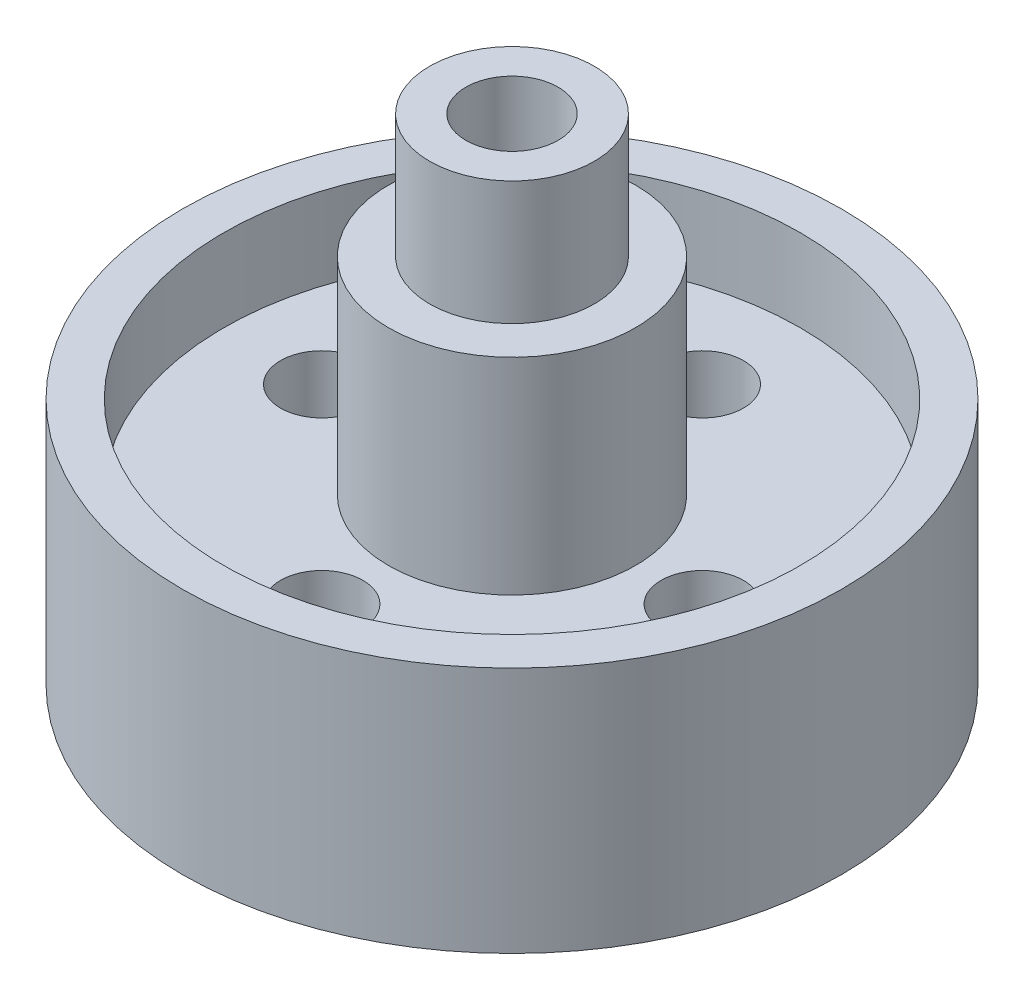
ISO-10303-21;
HEADER;
FILE_DESCRIPTION(('STEP AP214'),'2;1');
FILE_NAME('part.step','',(''),(''),'','','');
FILE_SCHEMA(('AUTOMOTIVE_DESIGN { 1 0 10303 214 1 1 1 1 }'));
ENDSEC;
DATA;
#1=APPLICATION_CONTEXT('core data for automotive mechanical design processes');
#2=APPLICATION_PROTOCOL_DEFINITION('international standard','automotive_design',2000,#1);
#3=PRODUCT_CONTEXT('',#1,'mechanical');
#4=PRODUCT('Part','Part','',(#3));
#5=PRODUCT_RELATED_PRODUCT_CATEGORY('part','',(#4));
#6=PRODUCT_DEFINITION_FORMATION('','',#4);
#7=PRODUCT_DEFINITION_CONTEXT('part definition',#1,'design');
#8=PRODUCT_DEFINITION('design','',#6,#7);
#9=PRODUCT_DEFINITION_SHAPE('','',#8);
#10=(LENGTH_UNIT() NAMED_UNIT(*) SI_UNIT(.MILLI.,.METRE.));
#11=(NAMED_UNIT(*) PLANE_ANGLE_UNIT() SI_UNIT($,.RADIAN.));
#12=(NAMED_UNIT(*) SI_UNIT($,.STERADIAN.) SOLID_ANGLE_UNIT());
#13=UNCERTAINTY_MEASURE_WITH_UNIT(LENGTH_MEASURE(1.E-05),#10,'distance_accuracy_value','');
#14=(GEOMETRIC_REPRESENTATION_CONTEXT(3) GLOBAL_UNCERTAINTY_ASSIGNED_CONTEXT((#13)) GLOBAL_UNIT_ASSIGNED_CONTEXT((#10,
#11,#12)) REPRESENTATION_CONTEXT('',''));
#15=CARTESIAN_POINT('',(0.,0.,0.));
#16=DIRECTION('',(0.,0.,1.));
#17=DIRECTION('',(1.,0.,0.));
#18=AXIS2_PLACEMENT_3D('',#15,#16,#17);
#19=CARTESIAN_POINT('',(0.,38.1,0.));
#20=DIRECTION('',(0.,-1.,0.));
#21=DIRECTION('',(0.,0.,-1.));
#22=AXIS2_PLACEMENT_3D('',#19,#20,#21);
#23=CYLINDRICAL_SURFACE('',#22,44.45);
#24=CARTESIAN_POINT('',(0.,25.4,0.));
#25=DIRECTION('',(0.,1.,0.));
#26=DIRECTION('',(0.,0.,1.));
#27=AXIS2_PLACEMENT_3D('',#24,#25,#26);
#28=CIRCLE('',#27,44.45);
#29=CARTESIAN_POINT('',(0.,25.4,-44.45));
#30=VERTEX_POINT('',#29);
#31=EDGE_CURVE('E10',#30,#30,#28,.T.);
#32=CARTESIAN_POINT('',(0.,38.1,0.));
#33=DIRECTION('',(0.,1.,0.));
#34=DIRECTION('',(0.,0.,1.));
#35=AXIS2_PLACEMENT_3D('',#32,#33,#34);
#36=CIRCLE('',#35,44.45);
#37=CARTESIAN_POINT('',(0.,38.1,-44.45));
#38=VERTEX_POINT('',#37);
#39=EDGE_CURVE('E49',#38,#38,#36,.T.);
#40=CARTESIAN_POINT('',(0.,25.4,-44.45));
#41=CARTESIAN_POINT('',(0.,25.5322916666667,-44.45));
#42=CARTESIAN_POINT('',(0.,25.6645833333333,-44.45));
#43=CARTESIAN_POINT('',(0.,25.9291666666667,-44.45));
#44=CARTESIAN_POINT('',(0.,26.0614583333333,-44.45));
#45=CARTESIAN_POINT('',(0.,26.3260416666667,-44.45));
#46=CARTESIAN_POINT('',(0.,26.4583333333333,-44.45));
#47=CARTESIAN_POINT('',(0.,26.7229166666667,-44.45));
#48=CARTESIAN_POINT('',(0.,26.8552083333333,-44.45));
#49=CARTESIAN_POINT('',(0.,27.1197916666667,-44.45));
#50=CARTESIAN_POINT('',(0.,27.2520833333333,-44.45));
#51=CARTESIAN_POINT('',(0.,27.5166666666667,-44.45));
#52=CARTESIAN_POINT('',(0.,27.6489583333333,-44.45));
#53=CARTESIAN_POINT('',(0.,27.9135416666667,-44.45));
#54=CARTESIAN_POINT('',(0.,28.0458333333333,-44.45));
#55=CARTESIAN_POINT('',(0.,28.3104166666667,-44.45));
#56=CARTESIAN_POINT('',(0.,28.4427083333333,-44.45));
#57=CARTESIAN_POINT('',(0.,28.7072916666667,-44.45));
#58=CARTESIAN_POINT('',(0.,28.8395833333333,-44.45));
#59=CARTESIAN_POINT('',(0.,29.1041666666667,-44.45));
#60=CARTESIAN_POINT('',(0.,29.2364583333333,-44.45));
#61=CARTESIAN_POINT('',(0.,29.5010416666667,-44.45));
#62=CARTESIAN_POINT('',(0.,29.6333333333333,-44.45));
#63=CARTESIAN_POINT('',(0.,29.8979166666667,-44.45));
#64=CARTESIAN_POINT('',(0.,30.0302083333333,-44.45));
#65=CARTESIAN_POINT('',(0.,30.2947916666667,-44.45));
#66=CARTESIAN_POINT('',(0.,30.4270833333333,-44.45));
#67=CARTESIAN_POINT('',(0.,30.6916666666667,-44.45));
#68=CARTESIAN_POINT('',(0.,30.8239583333333,-44.45));
#69=CARTESIAN_POINT('',(0.,31.0885416666667,-44.45));
#70=CARTESIAN_POINT('',(0.,31.2208333333333,-44.45));
#71=CARTESIAN_POINT('',(0.,31.4854166666667,-44.45));
#72=CARTESIAN_POINT('',(0.,31.6177083333333,-44.45));
#73=CARTESIAN_POINT('',(0.,31.8822916666667,-44.45));
#74=CARTESIAN_POINT('',(0.,32.0145833333333,-44.45));
#75=CARTESIAN_POINT('',(0.,32.2791666666667,-44.45));
#76=CARTESIAN_POINT('',(0.,32.4114583333333,-44.45));
#77=CARTESIAN_POINT('',(0.,32.6760416666667,-44.45));
#78=CARTESIAN_POINT('',(0.,32.8083333333333,-44.45));
#79=CARTESIAN_POINT('',(0.,33.0729166666667,-44.45));
#80=CARTESIAN_POINT('',(0.,33.2052083333333,-44.45));
#81=CARTESIAN_POINT('',(0.,33.4697916666667,-44.45));
#82=CARTESIAN_POINT('',(0.,33.6020833333333,-44.45));
#83=CARTESIAN_POINT('',(0.,33.8666666666667,-44.45));
#84=CARTESIAN_POINT('',(0.,33.9989583333333,-44.45));
#85=CARTESIAN_POINT('',(0.,34.2635416666667,-44.45));
#86=CARTESIAN_POINT('',(0.,34.3958333333333,-44.45));
#87=CARTESIAN_POINT('',(0.,34.6604166666667,-44.45));
#88=CARTESIAN_POINT('',(0.,34.7927083333333,-44.45));
#89=CARTESIAN_POINT('',(0.,35.0572916666667,-44.45));
#90=CARTESIAN_POINT('',(0.,35.1895833333333,-44.45));
#91=CARTESIAN_POINT('',(0.,35.4541666666667,-44.45));
#92=CARTESIAN_POINT('',(0.,35.5864583333333,-44.45));
#93=CARTESIAN_POINT('',(0.,35.8510416666667,-44.45));
#94=CARTESIAN_POINT('',(0.,35.9833333333333,-44.45));
#95=CARTESIAN_POINT('',(0.,36.2479166666667,-44.45));
#96=CARTESIAN_POINT('',(0.,36.3802083333333,-44.45));
#97=CARTESIAN_POINT('',(0.,36.6447916666667,-44.45));
#98=CARTESIAN_POINT('',(0.,36.7770833333333,-44.45));
#99=CARTESIAN_POINT('',(0.,37.0416666666667,-44.45));
#100=CARTESIAN_POINT('',(0.,37.1739583333333,-44.45));
#101=CARTESIAN_POINT('',(0.,37.4385416666667,-44.45));
#102=CARTESIAN_POINT('',(0.,37.5708333333333,-44.45));
#103=CARTESIAN_POINT('',(0.,37.8354166666667,-44.45));
#104=CARTESIAN_POINT('',(0.,37.9677083333333,-44.45));
#105=CARTESIAN_POINT('',(0.,38.1,-44.45));
#106=B_SPLINE_CURVE_WITH_KNOTS('',3,(#40,#41,#42,#43,#44,#45,#46,#47,#48,#49,#50,#51,#52,#53,
#54,#55,#56,#57,#58,#59,#60,#61,#62,#63,#64,#65,#66,#67,#68,#69,#70,#71,#72,#73,#74,#75,#76,#77,
#78,#79,#80,#81,#82,#83,#84,#85,#86,#87,#88,#89,#90,#91,#92,#93,#94,#95,#96,#97,#98,#99,#100,
#101,#102,#103,#104,#105),.UNSPECIFIED.,.F.,.F.,(4,2,2,2,2,2,2,2,2,2,2,2,2,2,2,2,2,2,2,2,2,2,2,
2,2,2,2,2,2,2,2,2,4),(0.,0.396874999999998,0.793749999999996,1.190625,1.5875,1.984375,2.38125,
2.778125,3.175,3.571875,3.96875,4.365625,4.7625,5.159375,5.55625,5.953125,6.35,6.746875,7.14375,
7.540625,7.9375,8.334375,8.73125,9.128125,9.525,9.921875,10.31875,10.715625,11.1125,11.509375,
11.90625,12.303125,12.7),.UNSPECIFIED.);
#107=EDGE_CURVE('BSEAM37',#30,#38,#106,.T.);
#108=ORIENTED_EDGE('',*,*,#31,.F.);
#109=ORIENTED_EDGE('',*,*,#39,.T.);
#110=ORIENTED_EDGE('',*,*,#107,.T.);
#111=ORIENTED_EDGE('',*,*,#107,.F.);
#112=EDGE_LOOP('',(#108,#110,#109,#111));
#113=FACE_BOUND('',#112,.T.);
#114=ADVANCED_FACE('F37',(#113),#23,.F.);
#115=CARTESIAN_POINT('',(0.,38.1,0.));
#116=DIRECTION('',(0.,-1.,0.));
#117=DIRECTION('',(0.,0.,-1.));
#118=AXIS2_PLACEMENT_3D('',#115,#116,#117);
#119=CYLINDRICAL_SURFACE('',#118,50.8);
#120=CARTESIAN_POINT('',(0.,38.1,0.));
#121=DIRECTION('',(0.,1.,0.));
#122=DIRECTION('',(0.,0.,1.));
#123=AXIS2_PLACEMENT_3D('',#120,#121,#122);
#124=CIRCLE('',#123,50.8);
#125=CARTESIAN_POINT('',(0.,38.1,-50.8));
#126=VERTEX_POINT('',#125);
#127=EDGE_CURVE('E44',#126,#126,#124,.T.);
#128=CARTESIAN_POINT('',(0.,0.,0.));
#129=DIRECTION('',(0.,1.,0.));
#130=DIRECTION('',(0.,0.,1.));
#131=AXIS2_PLACEMENT_3D('',#128,#129,#130);
#132=CIRCLE('',#131,50.8);
#133=CARTESIAN_POINT('',(0.,0.,-50.8));
#134=VERTEX_POINT('',#133);
#135=EDGE_CURVE('E55',#134,#134,#132,.T.);
#136=CARTESIAN_POINT('',(0.,38.1,-50.8));
#137=CARTESIAN_POINT('',(0.,37.703125,-50.8));
#138=CARTESIAN_POINT('',(0.,37.30625,-50.8));
#139=CARTESIAN_POINT('',(0.,36.5125,-50.8));
#140=CARTESIAN_POINT('',(0.,36.115625,-50.8));
#141=CARTESIAN_POINT('',(0.,35.321875,-50.8));
#142=CARTESIAN_POINT('',(0.,34.925,-50.8));
#143=CARTESIAN_POINT('',(0.,34.13125,-50.8));
#144=CARTESIAN_POINT('',(0.,33.734375,-50.8));
#145=CARTESIAN_POINT('',(0.,32.940625,-50.8));
#146=CARTESIAN_POINT('',(0.,32.54375,-50.8));
#147=CARTESIAN_POINT('',(0.,31.75,-50.8));
#148=CARTESIAN_POINT('',(0.,31.353125,-50.8));
#149=CARTESIAN_POINT('',(0.,30.559375,-50.8));
#150=CARTESIAN_POINT('',(0.,30.1625,-50.8));
#151=CARTESIAN_POINT('',(0.,29.36875,-50.8));
#152=CARTESIAN_POINT('',(0.,28.971875,-50.8));
#153=CARTESIAN_POINT('',(0.,28.178125,-50.8));
#154=CARTESIAN_POINT('',(0.,27.78125,-50.8));
#155=CARTESIAN_POINT('',(0.,26.9875,-50.8));
#156=CARTESIAN_POINT('',(0.,26.590625,-50.8));
#157=CARTESIAN_POINT('',(0.,25.796875,-50.8));
#158=CARTESIAN_POINT('',(0.,25.4,-50.8));
#159=CARTESIAN_POINT('',(0.,24.60625,-50.8));
#160=CARTESIAN_POINT('',(0.,24.209375,-50.8));
#161=CARTESIAN_POINT('',(0.,23.415625,-50.8));
#162=CARTESIAN_POINT('',(0.,23.01875,-50.8));
#163=CARTESIAN_POINT('',(0.,22.225,-50.8));
#164=CARTESIAN_POINT('',(0.,21.828125,-50.8));
#165=CARTESIAN_POINT('',(0.,21.034375,-50.8));
#166=CARTESIAN_POINT('',(0.,20.6375,-50.8));
#167=CARTESIAN_POINT('',(0.,19.84375,-50.8));
#168=CARTESIAN_POINT('',(0.,19.446875,-50.8));
#169=CARTESIAN_POINT('',(0.,18.653125,-50.8));
#170=CARTESIAN_POINT('',(0.,18.25625,-50.8));
#171=CARTESIAN_POINT('',(0.,17.4625,-50.8));
#172=CARTESIAN_POINT('',(0.,17.065625,-50.8));
#173=CARTESIAN_POINT('',(0.,16.271875,-50.8));
#174=CARTESIAN_POINT('',(0.,15.875,-50.8));
#175=CARTESIAN_POINT('',(0.,15.08125,-50.8));
#176=CARTESIAN_POINT('',(0.,14.684375,-50.8));
#177=CARTESIAN_POINT('',(0.,13.890625,-50.8));
#178=CARTESIAN_POINT('',(0.,13.49375,-50.8));
#179=CARTESIAN_POINT('',(0.,12.7,-50.8));
#180=CARTESIAN_POINT('',(0.,12.303125,-50.8));
#181=CARTESIAN_POINT('',(0.,11.509375,-50.8));
#182=CARTESIAN_POINT('',(0.,11.1125,-50.8));
#183=CARTESIAN_POINT('',(0.,10.31875,-50.8));
#184=CARTESIAN_POINT('',(0.,9.92187499999999,-50.8));
#185=CARTESIAN_POINT('',(0.,9.128125,-50.8));
#186=CARTESIAN_POINT('',(0.,8.73124999999999,-50.8));
#187=CARTESIAN_POINT('',(0.,7.93749999999999,-50.8));
#188=CARTESIAN_POINT('',(0.,7.54062499999999,-50.8));
#189=CARTESIAN_POINT('',(0.,6.746875,-50.8));
#190=CARTESIAN_POINT('',(0.,6.35,-50.8));
#191=CARTESIAN_POINT('',(0.,5.55625,-50.8));
#192=CARTESIAN_POINT('',(0.,5.159375,-50.8));
#193=CARTESIAN_POINT('',(0.,4.365625,-50.8));
#194=CARTESIAN_POINT('',(0.,3.96875,-50.8));
#195=CARTESIAN_POINT('',(0.,3.175,-50.8));
#196=CARTESIAN_POINT('',(0.,2.778125,-50.8));
#197=CARTESIAN_POINT('',(0.,1.984375,-50.8));
#198=CARTESIAN_POINT('',(0.,1.5875,-50.8));
#199=CARTESIAN_POINT('',(0.,0.79375,-50.8));
#200=CARTESIAN_POINT('',(0.,0.396875,-50.8));
#201=CARTESIAN_POINT('',(0.,0.,-50.8));
#202=B_SPLINE_CURVE_WITH_KNOTS('',3,(#136,#137,#138,#139,#140,#141,#142,#143,#144,#145,#146,
#147,#148,#149,#150,#151,#152,#153,#154,#155,#156,#157,#158,#159,#160,#161,#162,#163,#164,#165,
#166,#167,#168,#169,#170,#171,#172,#173,#174,#175,#176,#177,#178,#179,#180,#181,#182,#183,#184,
#185,#186,#187,#188,#189,#190,#191,#192,#193,#194,#195,#196,#197,#198,#199,#200,#201),
.UNSPECIFIED.,.F.,.F.,(4,2,2,2,2,2,2,2,2,2,2,2,2,2,2,2,2,2,2,2,2,2,2,2,2,2,2,2,2,2,2,2,4),(0.,
1.190625,2.38125,3.571875,4.7625,5.953125,7.14375,8.334375,9.52500000000001,10.715625,11.90625,
13.096875,14.2875,15.478125,16.66875,17.859375,19.05,20.240625,21.43125,22.621875,23.8125,
25.003125,26.19375,27.384375,28.575,29.765625,30.95625,32.146875,33.3375,34.528125,35.71875,
36.909375,38.1),.UNSPECIFIED.);
#203=EDGE_CURVE('BSEAM168',#126,#134,#202,.T.);
#204=ORIENTED_EDGE('',*,*,#127,.F.);
#205=ORIENTED_EDGE('',*,*,#135,.T.);
#206=ORIENTED_EDGE('',*,*,#203,.T.);
#207=ORIENTED_EDGE('',*,*,#203,.F.);
#208=EDGE_LOOP('',(#204,#206,#205,#207));
#209=FACE_BOUND('',#208,.T.);
#210=ADVANCED_FACE('F168',(#209),#119,.T.);
#211=CARTESIAN_POINT('',(0.,38.1,0.));
#212=DIRECTION('',(0.,1.,0.));
#213=DIRECTION('',(0.,0.,1.));
#214=AXIS2_PLACEMENT_3D('',#211,#212,#213);
#215=PLANE('',#214);
#216=ORIENTED_EDGE('',*,*,#39,.F.);
#217=EDGE_LOOP('',(#216));
#218=FACE_BOUND('',#217,.T.);
#219=ORIENTED_EDGE('',*,*,#127,.T.);
#220=EDGE_LOOP('',(#219));
#221=FACE_BOUND('',#220,.T.);
#222=ADVANCED_FACE('F147',(#218,#221),#215,.T.);
#223=CARTESIAN_POINT('',(0.,0.,0.));
#224=DIRECTION('',(0.,1.,0.));
#225=DIRECTION('',(0.,0.,1.));
#226=AXIS2_PLACEMENT_3D('',#223,#224,#225);
#227=PLANE('',#226);
#228=CARTESIAN_POINT('',(-29.337,0.,1.02429588037641E-13));
#229=DIRECTION('',(0.,1.,0.));
#230=DIRECTION('',(0.,0.,1.));
#231=AXIS2_PLACEMENT_3D('',#228,#229,#230);
#232=CIRCLE('',#231,6.35);
#233=CARTESIAN_POINT('',(-29.337,0.,6.3500000000001));
#234=VERTEX_POINT('',#233);
#235=EDGE_CURVE('E96',#234,#234,#232,.T.);
#236=ORIENTED_EDGE('',*,*,#235,.T.);
#237=EDGE_LOOP('',(#236));
#238=FACE_BOUND('',#237,.T.);
#239=CARTESIAN_POINT('',(0.,0.,29.337));
#240=DIRECTION('',(0.,1.,0.));
#241=DIRECTION('',(0.,0.,1.));
#242=AXIS2_PLACEMENT_3D('',#239,#240,#241);
#243=CIRCLE('',#242,6.35);
#244=CARTESIAN_POINT('',(0.,0.,35.687));
#245=VERTEX_POINT('',#244);
#246=EDGE_CURVE('E100',#245,#245,#243,.T.);
#247=ORIENTED_EDGE('',*,*,#246,.T.);
#248=EDGE_LOOP('',(#247));
#249=FACE_BOUND('',#248,.T.);
#250=CARTESIAN_POINT('',(29.337,0.,-3.07288764112923E-13));
#251=DIRECTION('',(0.,1.,0.));
#252=DIRECTION('',(0.,0.,1.));
#253=AXIS2_PLACEMENT_3D('',#250,#251,#252);
#254=CIRCLE('',#253,6.35);
#255=CARTESIAN_POINT('',(29.337,0.,6.34999999999969));
#256=VERTEX_POINT('',#255);
#257=EDGE_CURVE('E104',#256,#256,#254,.T.);
#258=ORIENTED_EDGE('',*,*,#257,.T.);
#259=EDGE_LOOP('',(#258));
#260=FACE_BOUND('',#259,.T.);
#261=CARTESIAN_POINT('',(0.,0.,-29.337));
#262=DIRECTION('',(0.,1.,0.));
#263=DIRECTION('',(0.,0.,1.));
#264=AXIS2_PLACEMENT_3D('',#261,#262,#263);
#265=CIRCLE('',#264,6.35);
#266=CARTESIAN_POINT('',(0.,0.,-22.987));
#267=VERTEX_POINT('',#266);
#268=EDGE_CURVE('E82',#267,#267,#265,.T.);
#269=ORIENTED_EDGE('',*,*,#268,.T.);
#270=EDGE_LOOP('',(#269));
#271=FACE_BOUND('',#270,.T.);
#272=ORIENTED_EDGE('',*,*,#135,.F.);
#273=EDGE_LOOP('',(#272));
#274=FACE_BOUND('',#273,.T.);
#275=CARTESIAN_POINT('',(0.,0.,0.));
#276=DIRECTION('',(0.,1.,0.));
#277=DIRECTION('',(0.,0.,1.));
#278=AXIS2_PLACEMENT_3D('',#275,#276,#277);
#279=CIRCLE('',#278,7.112);
#280=CARTESIAN_POINT('',(0.,0.,7.112));
#281=VERTEX_POINT('',#280);
#282=EDGE_CURVE('E77',#281,#281,#279,.T.);
#283=ORIENTED_EDGE('',*,*,#282,.T.);
#284=EDGE_LOOP('',(#283));
#285=FACE_BOUND('',#284,.T.);
#286=ADVANCED_FACE('F128',(#238,#249,#260,#271,#274,#285),#227,.F.);
#287=CARTESIAN_POINT('',(0.,25.4,0.));
#288=DIRECTION('',(0.,1.,0.));
#289=DIRECTION('',(0.,0.,1.));
#290=AXIS2_PLACEMENT_3D('',#287,#288,#289);
#291=PLANE('',#290);
#292=CARTESIAN_POINT('',(-29.337,25.4,1.02429588037641E-13));
#293=DIRECTION('',(0.,1.,0.));
#294=DIRECTION('',(0.,0.,1.));
#295=AXIS2_PLACEMENT_3D('',#292,#293,#294);
#296=CIRCLE('',#295,6.35);
#297=CARTESIAN_POINT('',(-29.337,25.4,6.3500000000001));
#298=VERTEX_POINT('',#297);
#299=EDGE_CURVE('E108',#298,#298,#296,.T.);
#300=ORIENTED_EDGE('',*,*,#299,.F.);
#301=EDGE_LOOP('',(#300));
#302=FACE_BOUND('',#301,.T.);
#303=CARTESIAN_POINT('',(0.,25.4,29.337));
#304=DIRECTION('',(0.,1.,0.));
#305=DIRECTION('',(0.,0.,1.));
#306=AXIS2_PLACEMENT_3D('',#303,#304,#305);
#307=CIRCLE('',#306,6.35);
#308=CARTESIAN_POINT('',(0.,25.4,35.687));
#309=VERTEX_POINT('',#308);
#310=EDGE_CURVE('E113',#309,#309,#307,.T.);
#311=ORIENTED_EDGE('',*,*,#310,.F.);
#312=EDGE_LOOP('',(#311));
#313=FACE_BOUND('',#312,.T.);
#314=CARTESIAN_POINT('',(29.337,25.4,-3.07288764112923E-13));
#315=DIRECTION('',(0.,1.,0.));
#316=DIRECTION('',(0.,0.,1.));
#317=AXIS2_PLACEMENT_3D('',#314,#315,#316);
#318=CIRCLE('',#317,6.35);
#319=CARTESIAN_POINT('',(29.337,25.4,6.34999999999969));
#320=VERTEX_POINT('',#319);
#321=EDGE_CURVE('E109',#320,#320,#318,.T.);
#322=ORIENTED_EDGE('',*,*,#321,.F.);
#323=EDGE_LOOP('',(#322));
#324=FACE_BOUND('',#323,.T.);
#325=CARTESIAN_POINT('',(0.,25.4,-29.337));
#326=DIRECTION('',(0.,1.,0.));
#327=DIRECTION('',(0.,0.,1.));
#328=AXIS2_PLACEMENT_3D('',#325,#326,#327);
#329=CIRCLE('',#328,6.35);
#330=CARTESIAN_POINT('',(0.,25.4,-22.987));
#331=VERTEX_POINT('',#330);
#332=EDGE_CURVE('E92',#331,#331,#329,.T.);
#333=ORIENTED_EDGE('',*,*,#332,.F.);
#334=EDGE_LOOP('',(#333));
#335=FACE_BOUND('',#334,.T.);
#336=CARTESIAN_POINT('',(0.,25.4,0.));
#337=DIRECTION('',(0.,1.,0.));
#338=DIRECTION('',(0.,0.,1.));
#339=AXIS2_PLACEMENT_3D('',#336,#337,#338);
#340=CIRCLE('',#339,19.05);
#341=CARTESIAN_POINT('',(0.,25.4,19.05));
#342=VERTEX_POINT('',#341);
#343=EDGE_CURVE('E60',#342,#342,#340,.T.);
#344=ORIENTED_EDGE('',*,*,#343,.F.);
#345=EDGE_LOOP('',(#344));
#346=FACE_BOUND('',#345,.T.);
#347=ORIENTED_EDGE('',*,*,#31,.T.);
#348=EDGE_LOOP('',(#347));
#349=FACE_BOUND('',#348,.T.);
#350=ADVANCED_FACE('F124',(#302,#313,#324,#335,#346,#349),#291,.T.);
#351=CARTESIAN_POINT('',(0.,57.15,0.));
#352=DIRECTION('',(0.,-1.,0.));
#353=DIRECTION('',(0.,0.,-1.));
#354=AXIS2_PLACEMENT_3D('',#351,#352,#353);
#355=CYLINDRICAL_SURFACE('',#354,19.05);
#356=ORIENTED_EDGE('',*,*,#343,.T.);
#357=EDGE_LOOP('',(#356));
#358=FACE_BOUND('',#357,.T.);
#359=CARTESIAN_POINT('',(0.,57.15,0.));
#360=DIRECTION('',(0.,1.,0.));
#361=DIRECTION('',(0.,0.,1.));
#362=AXIS2_PLACEMENT_3D('',#359,#360,#361);
#363=CIRCLE('',#362,19.05);
#364=CARTESIAN_POINT('',(0.,57.15,19.05));
#365=VERTEX_POINT('',#364);
#366=EDGE_CURVE('E65',#365,#365,#363,.T.);
#367=ORIENTED_EDGE('',*,*,#366,.F.);
#368=EDGE_LOOP('',(#367));
#369=FACE_BOUND('',#368,.T.);
#370=ADVANCED_FACE('F127',(#358,#369),#355,.T.);
#371=CARTESIAN_POINT('',(0.,57.15,0.));
#372=DIRECTION('',(0.,1.,0.));
#373=DIRECTION('',(0.,0.,1.));
#374=AXIS2_PLACEMENT_3D('',#371,#372,#373);
#375=PLANE('',#374);
#376=CARTESIAN_POINT('',(0.,57.15,0.));
#377=DIRECTION('',(0.,1.,0.));
#378=DIRECTION('',(0.,0.,1.));
#379=AXIS2_PLACEMENT_3D('',#376,#377,#378);
#380=CIRCLE('',#379,12.7);
#381=CARTESIAN_POINT('',(0.,57.15,12.7));
#382=VERTEX_POINT('',#381);
#383=EDGE_CURVE('E70',#382,#382,#380,.T.);
#384=ORIENTED_EDGE('',*,*,#383,.F.);
#385=EDGE_LOOP('',(#384));
#386=FACE_BOUND('',#385,.T.);
#387=ORIENTED_EDGE('',*,*,#366,.T.);
#388=EDGE_LOOP('',(#387));
#389=FACE_BOUND('',#388,.T.);
#390=ADVANCED_FACE('F156',(#386,#389),#375,.T.);
#391=CARTESIAN_POINT('',(0.,76.2,0.));
#392=DIRECTION('',(0.,-1.,0.));
#393=DIRECTION('',(0.,0.,-1.));
#394=AXIS2_PLACEMENT_3D('',#391,#392,#393);
#395=CYLINDRICAL_SURFACE('',#394,7.112);
#396=CARTESIAN_POINT('',(0.,76.2,0.));
#397=DIRECTION('',(0.,1.,0.));
#398=DIRECTION('',(0.,0.,1.));
#399=AXIS2_PLACEMENT_3D('',#396,#397,#398);
#400=CIRCLE('',#399,7.112);
#401=CARTESIAN_POINT('',(0.,76.2,7.112));
#402=VERTEX_POINT('',#401);
#403=EDGE_CURVE('E81',#402,#402,#400,.T.);
#404=ORIENTED_EDGE('',*,*,#403,.T.);
#405=EDGE_LOOP('',(#404));
#406=FACE_BOUND('',#405,.T.);
#407=ORIENTED_EDGE('',*,*,#282,.F.);
#408=EDGE_LOOP('',(#407));
#409=FACE_BOUND('',#408,.T.);
#410=ADVANCED_FACE('F153',(#406,#409),#395,.F.);
#411=CARTESIAN_POINT('',(0.,76.2,0.));
#412=DIRECTION('',(0.,-1.,0.));
#413=DIRECTION('',(0.,0.,-1.));
#414=AXIS2_PLACEMENT_3D('',#411,#412,#413);
#415=CYLINDRICAL_SURFACE('',#414,12.7);
#416=ORIENTED_EDGE('',*,*,#383,.T.);
#417=EDGE_LOOP('',(#416));
#418=FACE_BOUND('',#417,.T.);
#419=CARTESIAN_POINT('',(0.,76.2,0.));
#420=DIRECTION('',(0.,1.,0.));
#421=DIRECTION('',(0.,0.,1.));
#422=AXIS2_PLACEMENT_3D('',#419,#420,#421);
#423=CIRCLE('',#422,12.7);
#424=CARTESIAN_POINT('',(0.,76.2,12.7));
#425=VERTEX_POINT('',#424);
#426=EDGE_CURVE('E76',#425,#425,#423,.T.);
#427=ORIENTED_EDGE('',*,*,#426,.F.);
#428=EDGE_LOOP('',(#427));
#429=FACE_BOUND('',#428,.T.);
#430=ADVANCED_FACE('F155',(#418,#429),#415,.T.);
#431=CARTESIAN_POINT('',(0.,76.2,0.));
#432=DIRECTION('',(0.,1.,0.));
#433=DIRECTION('',(0.,0.,1.));
#434=AXIS2_PLACEMENT_3D('',#431,#432,#433);
#435=PLANE('',#434);
#436=ORIENTED_EDGE('',*,*,#403,.F.);
#437=EDGE_LOOP('',(#436));
#438=FACE_BOUND('',#437,.T.);
#439=ORIENTED_EDGE('',*,*,#426,.T.);
#440=EDGE_LOOP('',(#439));
#441=FACE_BOUND('',#440,.T.);
#442=ADVANCED_FACE('F141',(#438,#441),#435,.T.);
#443=CARTESIAN_POINT('',(0.,-50.8,-29.337));
#444=DIRECTION('',(0.,1.,0.));
#445=DIRECTION('',(0.,0.,1.));
#446=AXIS2_PLACEMENT_3D('',#443,#444,#445);
#447=CYLINDRICAL_SURFACE('',#446,6.35);
#448=ORIENTED_EDGE('',*,*,#332,.T.);
#449=EDGE_LOOP('',(#448));
#450=FACE_BOUND('',#449,.T.);
#451=ORIENTED_EDGE('',*,*,#268,.F.);
#452=EDGE_LOOP('',(#451));
#453=FACE_BOUND('',#452,.T.);
#454=ADVANCED_FACE('F137',(#450,#453),#447,.F.);
#455=CARTESIAN_POINT('',(29.337,-50.8,-3.07288764112923E-13));
#456=DIRECTION('',(0.,1.,0.));
#457=DIRECTION('',(0.,0.,1.));
#458=AXIS2_PLACEMENT_3D('',#455,#456,#457);
#459=CYLINDRICAL_SURFACE('',#458,6.35);
#460=ORIENTED_EDGE('',*,*,#321,.T.);
#461=EDGE_LOOP('',(#460));
#462=FACE_BOUND('',#461,.T.);
#463=ORIENTED_EDGE('',*,*,#257,.F.);
#464=EDGE_LOOP('',(#463));
#465=FACE_BOUND('',#464,.T.);
#466=ADVANCED_FACE('F140',(#462,#465),#459,.F.);
#467=CARTESIAN_POINT('',(0.,-50.8,29.337));
#468=DIRECTION('',(0.,1.,0.));
#469=DIRECTION('',(0.,0.,1.));
#470=AXIS2_PLACEMENT_3D('',#467,#468,#469);
#471=CYLINDRICAL_SURFACE('',#470,6.35);
#472=ORIENTED_EDGE('',*,*,#310,.T.);
#473=EDGE_LOOP('',(#472));
#474=FACE_BOUND('',#473,.T.);
#475=ORIENTED_EDGE('',*,*,#246,.F.);
#476=EDGE_LOOP('',(#475));
#477=FACE_BOUND('',#476,.T.);
#478=ADVANCED_FACE('F240',(#474,#477),#471,.F.);
#479=CARTESIAN_POINT('',(-29.337,-50.8,1.02429588037641E-13));
#480=DIRECTION('',(0.,1.,0.));
#481=DIRECTION('',(0.,0.,1.));
#482=AXIS2_PLACEMENT_3D('',#479,#480,#481);
#483=CYLINDRICAL_SURFACE('',#482,6.35);
#484=ORIENTED_EDGE('',*,*,#299,.T.);
#485=EDGE_LOOP('',(#484));
#486=FACE_BOUND('',#485,.T.);
#487=ORIENTED_EDGE('',*,*,#235,.F.);
#488=EDGE_LOOP('',(#487));
#489=FACE_BOUND('',#488,.T.);
#490=ADVANCED_FACE('F121',(#486,#489),#483,.F.);
#491=CLOSED_SHELL('',(#114,#210,#222,#286,#350,#370,#390,#410,#430,#442,#454,#466,#478,#490));
#492=MANIFOLD_SOLID_BREP('B2',#491);
#493=ADVANCED_BREP_SHAPE_REPRESENTATION('',(#18,#492),#14);
#494=SHAPE_DEFINITION_REPRESENTATION(#9,#493);
ENDSEC;
END-ISO-10303-21;
